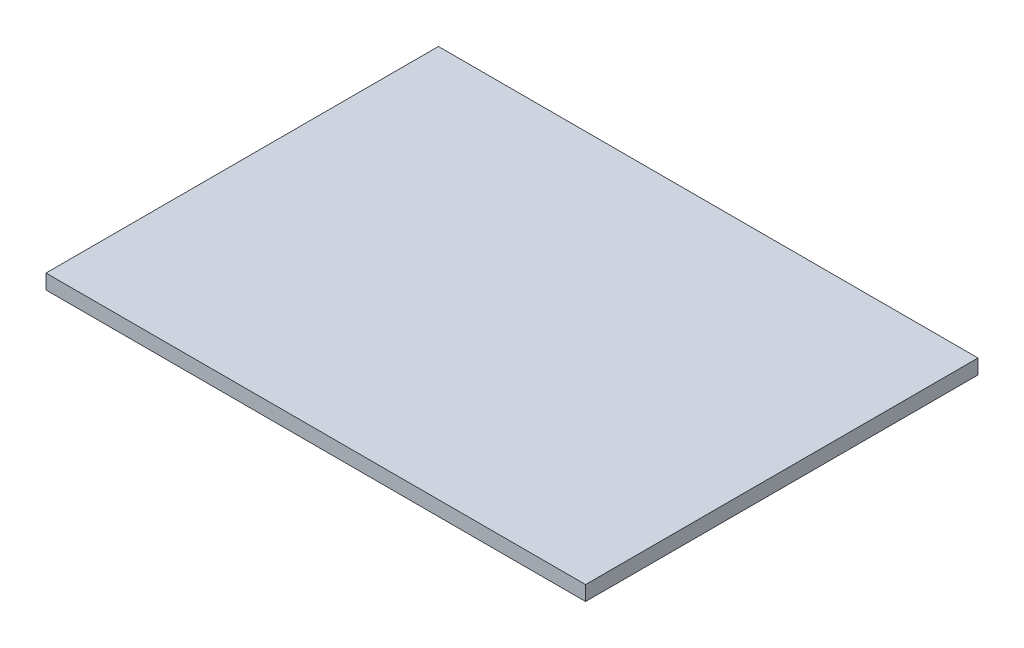
ISO-10303-21;
HEADER;
FILE_DESCRIPTION(('STEP AP214'),'2;1');
FILE_NAME('part.step','',(''),(''),'','','');
FILE_SCHEMA(('AUTOMOTIVE_DESIGN { 1 0 10303 214 1 1 1 1 }'));
ENDSEC;
DATA;
#1=APPLICATION_CONTEXT('core data for automotive mechanical design processes');
#2=APPLICATION_PROTOCOL_DEFINITION('international standard','automotive_design',2000,#1);
#3=PRODUCT_CONTEXT('',#1,'mechanical');
#4=PRODUCT('Part','Part','',(#3));
#5=PRODUCT_RELATED_PRODUCT_CATEGORY('part','',(#4));
#6=PRODUCT_DEFINITION_FORMATION('','',#4);
#7=PRODUCT_DEFINITION_CONTEXT('part definition',#1,'design');
#8=PRODUCT_DEFINITION('design','',#6,#7);
#9=PRODUCT_DEFINITION_SHAPE('','',#8);
#10=(LENGTH_UNIT() NAMED_UNIT(*) SI_UNIT(.MILLI.,.METRE.));
#11=(NAMED_UNIT(*) PLANE_ANGLE_UNIT() SI_UNIT($,.RADIAN.));
#12=(NAMED_UNIT(*) SI_UNIT($,.STERADIAN.) SOLID_ANGLE_UNIT());
#13=UNCERTAINTY_MEASURE_WITH_UNIT(LENGTH_MEASURE(1.E-05),#10,'distance_accuracy_value','');
#14=(GEOMETRIC_REPRESENTATION_CONTEXT(3) GLOBAL_UNCERTAINTY_ASSIGNED_CONTEXT((#13)) GLOBAL_UNIT_ASSIGNED_CONTEXT((#10,
#11,#12)) REPRESENTATION_CONTEXT('',''));
#15=CARTESIAN_POINT('',(0.,0.,0.));
#16=DIRECTION('',(0.,0.,1.));
#17=DIRECTION('',(1.,0.,0.));
#18=AXIS2_PLACEMENT_3D('',#15,#16,#17);
#19=CARTESIAN_POINT('',(0.,1.5,0.));
#20=DIRECTION('',(0.,0.,-1.));
#21=DIRECTION('',(-1.,0.,0.));
#22=AXIS2_PLACEMENT_3D('',#19,#20,#21);
#23=PLANE('',#22);
#24=DIRECTION('',(1.,0.,0.));
#25=VECTOR('',#24,1.);
#26=CARTESIAN_POINT('',(0.,0.,0.));
#27=LINE('',#26,#25);
#28=CARTESIAN_POINT('',(-3.,0.,0.));
#29=VERTEX_POINT('',#28);
#30=CARTESIAN_POINT('',(52.,0.,0.));
#31=VERTEX_POINT('',#30);
#32=EDGE_CURVE('E77',#29,#31,#27,.T.);
#33=ORIENTED_EDGE('',*,*,#32,.T.);
#34=DIRECTION('',(0.,-1.,0.));
#35=VECTOR('',#34,1.);
#36=CARTESIAN_POINT('',(52.,1.5,0.));
#37=LINE('',#36,#35);
#38=CARTESIAN_POINT('',(52.,1.5,0.));
#39=VERTEX_POINT('',#38);
#40=EDGE_CURVE('E11',#39,#31,#37,.T.);
#41=ORIENTED_EDGE('',*,*,#40,.F.);
#42=DIRECTION('',(1.,0.,0.));
#43=VECTOR('',#42,1.);
#44=CARTESIAN_POINT('',(-3.,1.5,0.));
#45=LINE('',#44,#43);
#46=CARTESIAN_POINT('',(-3.,1.5,0.));
#47=VERTEX_POINT('',#46);
#48=EDGE_CURVE('E82',#47,#39,#45,.T.);
#49=ORIENTED_EDGE('',*,*,#48,.F.);
#50=DIRECTION('',(0.,-1.,0.));
#51=VECTOR('',#50,1.);
#52=CARTESIAN_POINT('',(-3.,1.5,0.));
#53=LINE('',#52,#51);
#54=EDGE_CURVE('E98',#47,#29,#53,.T.);
#55=ORIENTED_EDGE('',*,*,#54,.T.);
#56=EDGE_LOOP('',(#33,#41,#49,#55));
#57=FACE_BOUND('',#56,.T.);
#58=ADVANCED_FACE('F38',(#57),#23,.F.);
#59=CARTESIAN_POINT('',(52.,1.5,0.));
#60=DIRECTION('',(-1.,0.,0.));
#61=DIRECTION('',(0.,0.,1.));
#62=AXIS2_PLACEMENT_3D('',#59,#60,#61);
#63=PLANE('',#62);
#64=DIRECTION('',(0.,0.,-1.));
#65=VECTOR('',#64,1.);
#66=CARTESIAN_POINT('',(52.,0.,0.));
#67=LINE('',#66,#65);
#68=CARTESIAN_POINT('',(52.,0.,-40.));
#69=VERTEX_POINT('',#68);
#70=EDGE_CURVE('E94',#31,#69,#67,.T.);
#71=ORIENTED_EDGE('',*,*,#70,.T.);
#72=DIRECTION('',(0.,-1.,0.));
#73=VECTOR('',#72,1.);
#74=CARTESIAN_POINT('',(52.,1.5,-40.));
#75=LINE('',#74,#73);
#76=CARTESIAN_POINT('',(52.,1.5,-40.));
#77=VERTEX_POINT('',#76);
#78=EDGE_CURVE('E46',#77,#69,#75,.T.);
#79=ORIENTED_EDGE('',*,*,#78,.F.);
#80=DIRECTION('',(0.,0.,-1.));
#81=VECTOR('',#80,1.);
#82=CARTESIAN_POINT('',(52.,1.5,0.));
#83=LINE('',#82,#81);
#84=EDGE_CURVE('E85',#39,#77,#83,.T.);
#85=ORIENTED_EDGE('',*,*,#84,.F.);
#86=ORIENTED_EDGE('',*,*,#40,.T.);
#87=EDGE_LOOP('',(#71,#79,#85,#86));
#88=FACE_BOUND('',#87,.T.);
#89=ADVANCED_FACE('F93',(#88),#63,.F.);
#90=CARTESIAN_POINT('',(0.,1.5,-40.));
#91=DIRECTION('',(0.,0.,1.));
#92=DIRECTION('',(1.,0.,0.));
#93=AXIS2_PLACEMENT_3D('',#90,#91,#92);
#94=PLANE('',#93);
#95=DIRECTION('',(-1.,0.,0.));
#96=VECTOR('',#95,1.);
#97=CARTESIAN_POINT('',(0.,0.,-40.));
#98=LINE('',#97,#96);
#99=CARTESIAN_POINT('',(-3.,0.,-40.));
#100=VERTEX_POINT('',#99);
#101=EDGE_CURVE('E70',#69,#100,#98,.T.);
#102=ORIENTED_EDGE('',*,*,#101,.T.);
#103=DIRECTION('',(0.,-1.,0.));
#104=VECTOR('',#103,1.);
#105=CARTESIAN_POINT('',(-3.,1.5,-40.));
#106=LINE('',#105,#104);
#107=CARTESIAN_POINT('',(-3.,1.5,-40.));
#108=VERTEX_POINT('',#107);
#109=EDGE_CURVE('E95',#108,#100,#106,.T.);
#110=ORIENTED_EDGE('',*,*,#109,.F.);
#111=DIRECTION('',(-1.,0.,0.));
#112=VECTOR('',#111,1.);
#113=CARTESIAN_POINT('',(0.,1.5,-40.));
#114=LINE('',#113,#112);
#115=EDGE_CURVE('E89',#77,#108,#114,.T.);
#116=ORIENTED_EDGE('',*,*,#115,.F.);
#117=ORIENTED_EDGE('',*,*,#78,.T.);
#118=EDGE_LOOP('',(#102,#110,#116,#117));
#119=FACE_BOUND('',#118,.T.);
#120=ADVANCED_FACE('F96',(#119),#94,.F.);
#121=CARTESIAN_POINT('',(-3.,1.5,-40.));
#122=DIRECTION('',(1.,0.,0.));
#123=DIRECTION('',(0.,0.,-1.));
#124=AXIS2_PLACEMENT_3D('',#121,#122,#123);
#125=PLANE('',#124);
#126=DIRECTION('',(0.,0.,1.));
#127=VECTOR('',#126,1.);
#128=CARTESIAN_POINT('',(-3.,0.,-40.));
#129=LINE('',#128,#127);
#130=EDGE_CURVE('E105',#100,#29,#129,.T.);
#131=ORIENTED_EDGE('',*,*,#130,.T.);
#132=ORIENTED_EDGE('',*,*,#54,.F.);
#133=DIRECTION('',(0.,0.,1.));
#134=VECTOR('',#133,1.);
#135=CARTESIAN_POINT('',(-3.,1.5,-40.));
#136=LINE('',#135,#134);
#137=EDGE_CURVE('E54',#108,#47,#136,.T.);
#138=ORIENTED_EDGE('',*,*,#137,.F.);
#139=ORIENTED_EDGE('',*,*,#109,.T.);
#140=EDGE_LOOP('',(#131,#132,#138,#139));
#141=FACE_BOUND('',#140,.T.);
#142=ADVANCED_FACE('F110',(#141),#125,.F.);
#143=CARTESIAN_POINT('',(0.,1.5,0.));
#144=DIRECTION('',(0.,1.,0.));
#145=DIRECTION('',(0.,0.,1.));
#146=AXIS2_PLACEMENT_3D('',#143,#144,#145);
#147=PLANE('',#146);
#148=ORIENTED_EDGE('',*,*,#48,.T.);
#149=ORIENTED_EDGE('',*,*,#84,.T.);
#150=ORIENTED_EDGE('',*,*,#115,.T.);
#151=ORIENTED_EDGE('',*,*,#137,.T.);
#152=EDGE_LOOP('',(#148,#149,#150,#151));
#153=FACE_BOUND('',#152,.T.);
#154=ADVANCED_FACE('F87',(#153),#147,.T.);
#155=CARTESIAN_POINT('',(0.,0.,0.));
#156=DIRECTION('',(0.,1.,0.));
#157=DIRECTION('',(0.,0.,1.));
#158=AXIS2_PLACEMENT_3D('',#155,#156,#157);
#159=PLANE('',#158);
#160=ORIENTED_EDGE('',*,*,#32,.F.);
#161=ORIENTED_EDGE('',*,*,#130,.F.);
#162=ORIENTED_EDGE('',*,*,#101,.F.);
#163=ORIENTED_EDGE('',*,*,#70,.F.);
#164=EDGE_LOOP('',(#160,#161,#162,#163));
#165=FACE_BOUND('',#164,.T.);
#166=ADVANCED_FACE('F111',(#165),#159,.F.);
#167=CLOSED_SHELL('',(#58,#89,#120,#142,#154,#166));
#168=MANIFOLD_SOLID_BREP('B2',#167);
#169=ADVANCED_BREP_SHAPE_REPRESENTATION('',(#18,#168),#14);
#170=SHAPE_DEFINITION_REPRESENTATION(#9,#169);
ENDSEC;
END-ISO-10303-21;
